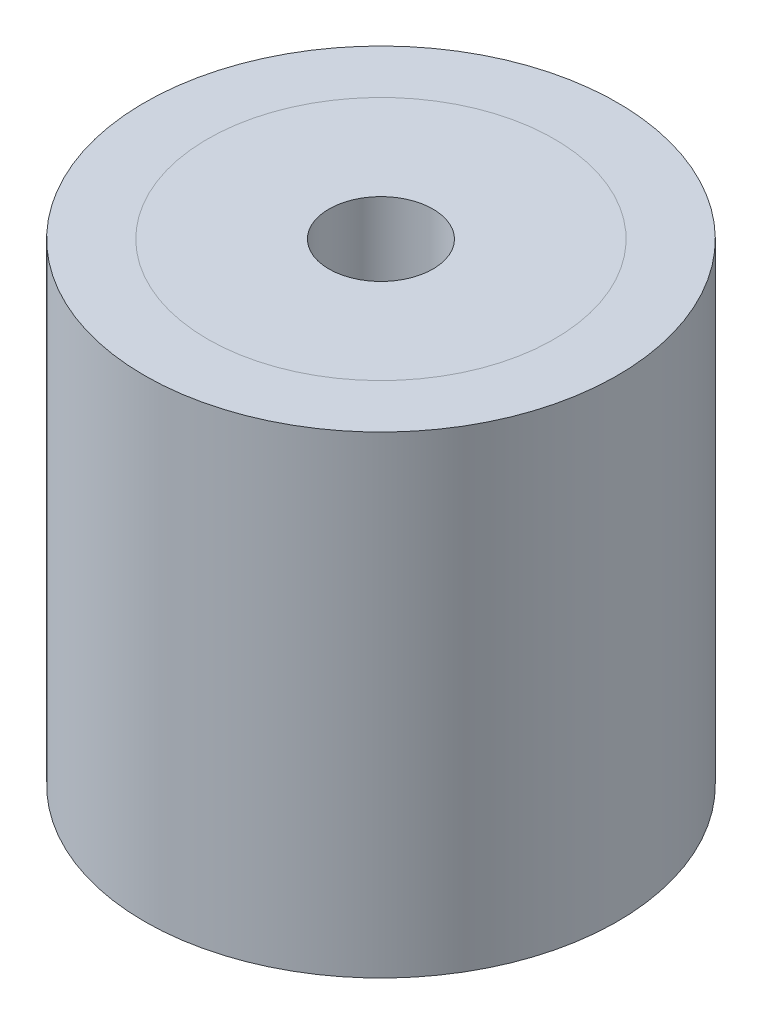
ISO-10303-21;
HEADER;
FILE_DESCRIPTION(('STEP AP214'),'2;1');
FILE_NAME('part.step','',(''),(''),'','','');
FILE_SCHEMA(('AUTOMOTIVE_DESIGN { 1 0 10303 214 1 1 1 1 }'));
ENDSEC;
DATA;
#1=APPLICATION_CONTEXT('core data for automotive mechanical design processes');
#2=APPLICATION_PROTOCOL_DEFINITION('international standard','automotive_design',2000,#1);
#3=PRODUCT_CONTEXT('',#1,'mechanical');
#4=PRODUCT('Part','Part','',(#3));
#5=PRODUCT_RELATED_PRODUCT_CATEGORY('part','',(#4));
#6=PRODUCT_DEFINITION_FORMATION('','',#4);
#7=PRODUCT_DEFINITION_CONTEXT('part definition',#1,'design');
#8=PRODUCT_DEFINITION('design','',#6,#7);
#9=PRODUCT_DEFINITION_SHAPE('','',#8);
#10=(LENGTH_UNIT() NAMED_UNIT(*) SI_UNIT(.MILLI.,.METRE.));
#11=(NAMED_UNIT(*) PLANE_ANGLE_UNIT() SI_UNIT($,.RADIAN.));
#12=(NAMED_UNIT(*) SI_UNIT($,.STERADIAN.) SOLID_ANGLE_UNIT());
#13=UNCERTAINTY_MEASURE_WITH_UNIT(LENGTH_MEASURE(1.E-05),#10,'distance_accuracy_value','');
#14=(GEOMETRIC_REPRESENTATION_CONTEXT(3) GLOBAL_UNCERTAINTY_ASSIGNED_CONTEXT((#13)) GLOBAL_UNIT_ASSIGNED_CONTEXT((#10,
#11,#12)) REPRESENTATION_CONTEXT('',''));
#15=CARTESIAN_POINT('',(0.,0.,0.));
#16=DIRECTION('',(0.,0.,1.));
#17=DIRECTION('',(1.,0.,0.));
#18=AXIS2_PLACEMENT_3D('',#15,#16,#17);
#19=CARTESIAN_POINT('',(0.,-7.5,0.));
#20=DIRECTION('',(0.,1.,0.));
#21=DIRECTION('',(0.,0.,1.));
#22=AXIS2_PLACEMENT_3D('',#19,#20,#21);
#23=PLANE('',#22);
#24=CARTESIAN_POINT('',(0.,-7.5,0.));
#25=DIRECTION('',(0.,1.,0.));
#26=DIRECTION('',(0.,0.,1.));
#27=AXIS2_PLACEMENT_3D('',#24,#25,#26);
#28=CIRCLE('',#27,7.5);
#29=CARTESIAN_POINT('',(0.,-7.5,7.5));
#30=VERTEX_POINT('',#29);
#31=EDGE_CURVE('E61',#30,#30,#28,.T.);
#32=ORIENTED_EDGE('',*,*,#31,.F.);
#33=EDGE_LOOP('',(#32));
#34=FACE_BOUND('',#33,.T.);
#35=CARTESIAN_POINT('',(0.,-7.5,0.));
#36=DIRECTION('',(0.,1.,0.));
#37=DIRECTION('',(0.,0.,1.));
#38=AXIS2_PLACEMENT_3D('',#35,#36,#37);
#39=CIRCLE('',#38,5.5);
#40=CARTESIAN_POINT('',(0.,-7.5,5.5));
#41=VERTEX_POINT('',#40);
#42=EDGE_CURVE('E10',#41,#41,#39,.F.);
#43=ORIENTED_EDGE('',*,*,#42,.F.);
#44=EDGE_LOOP('',(#43));
#45=FACE_BOUND('',#44,.T.);
#46=ADVANCED_FACE('F41',(#34,#45),#23,.F.);
#47=CARTESIAN_POINT('',(0.,7.5,0.));
#48=DIRECTION('',(0.,1.,0.));
#49=DIRECTION('',(0.,0.,1.));
#50=AXIS2_PLACEMENT_3D('',#47,#48,#49);
#51=PLANE('',#50);
#52=CARTESIAN_POINT('',(0.,7.5,0.));
#53=DIRECTION('',(0.,1.,0.));
#54=DIRECTION('',(0.,0.,1.));
#55=AXIS2_PLACEMENT_3D('',#52,#53,#54);
#56=CIRCLE('',#55,7.5);
#57=CARTESIAN_POINT('',(0.,7.5,7.5));
#58=VERTEX_POINT('',#57);
#59=EDGE_CURVE('E56',#58,#58,#56,.T.);
#60=ORIENTED_EDGE('',*,*,#59,.T.);
#61=EDGE_LOOP('',(#60));
#62=FACE_BOUND('',#61,.T.);
#63=CARTESIAN_POINT('',(0.,7.5,0.));
#64=DIRECTION('',(0.,1.,0.));
#65=DIRECTION('',(0.,0.,1.));
#66=AXIS2_PLACEMENT_3D('',#63,#64,#65);
#67=CIRCLE('',#66,5.5);
#68=CARTESIAN_POINT('',(0.,7.5,5.5));
#69=VERTEX_POINT('',#68);
#70=EDGE_CURVE('E45',#69,#69,#67,.F.);
#71=ORIENTED_EDGE('',*,*,#70,.T.);
#72=EDGE_LOOP('',(#71));
#73=FACE_BOUND('',#72,.T.);
#74=ADVANCED_FACE('F78',(#62,#73),#51,.T.);
#75=CARTESIAN_POINT('',(0.,7.5,0.));
#76=DIRECTION('',(0.,-1.,0.));
#77=DIRECTION('',(0.,0.,-1.));
#78=AXIS2_PLACEMENT_3D('',#75,#76,#77);
#79=CYLINDRICAL_SURFACE('',#78,7.5);
#80=ORIENTED_EDGE('',*,*,#59,.F.);
#81=EDGE_LOOP('',(#80));
#82=FACE_BOUND('',#81,.T.);
#83=ORIENTED_EDGE('',*,*,#31,.T.);
#84=EDGE_LOOP('',(#83));
#85=FACE_BOUND('',#84,.T.);
#86=ADVANCED_FACE('F43',(#82,#85),#79,.T.);
#87=ORIENTED_EDGE('',*,*,#70,.F.);
#88=EDGE_LOOP('',(#87));
#89=FACE_BOUND('',#88,.T.);
#90=CARTESIAN_POINT('',(0.,7.5,0.));
#91=DIRECTION('',(0.,1.,0.));
#92=DIRECTION('',(0.,0.,1.));
#93=AXIS2_PLACEMENT_3D('',#90,#91,#92);
#94=CIRCLE('',#93,1.64999999999999);
#95=CARTESIAN_POINT('',(0.,7.5,1.64999999999999));
#96=VERTEX_POINT('',#95);
#97=EDGE_CURVE('E62',#96,#96,#94,.T.);
#98=ORIENTED_EDGE('',*,*,#97,.F.);
#99=EDGE_LOOP('',(#98));
#100=FACE_BOUND('',#99,.T.);
#101=ADVANCED_FACE('F73',(#89,#100),#51,.T.);
#102=ORIENTED_EDGE('',*,*,#42,.T.);
#103=EDGE_LOOP('',(#102));
#104=FACE_BOUND('',#103,.T.);
#105=CARTESIAN_POINT('',(0.,-7.5,0.));
#106=DIRECTION('',(0.,1.,0.));
#107=DIRECTION('',(0.,0.,1.));
#108=AXIS2_PLACEMENT_3D('',#105,#106,#107);
#109=CIRCLE('',#108,1.64999999999999);
#110=CARTESIAN_POINT('',(0.,-7.5,1.64999999999999));
#111=VERTEX_POINT('',#110);
#112=EDGE_CURVE('E58',#111,#111,#109,.T.);
#113=ORIENTED_EDGE('',*,*,#112,.T.);
#114=EDGE_LOOP('',(#113));
#115=FACE_BOUND('',#114,.T.);
#116=ADVANCED_FACE('F75',(#104,#115),#23,.F.);
#117=CARTESIAN_POINT('',(0.,7.5,0.));
#118=DIRECTION('',(0.,1.,0.));
#119=DIRECTION('',(0.,0.,1.));
#120=AXIS2_PLACEMENT_3D('',#117,#118,#119);
#121=CYLINDRICAL_SURFACE('',#120,1.64999999999999);
#122=ORIENTED_EDGE('',*,*,#97,.T.);
#123=EDGE_LOOP('',(#122));
#124=FACE_BOUND('',#123,.T.);
#125=ORIENTED_EDGE('',*,*,#112,.F.);
#126=EDGE_LOOP('',(#125));
#127=FACE_BOUND('',#126,.T.);
#128=ADVANCED_FACE('F70',(#124,#127),#121,.F.);
#129=CLOSED_SHELL('',(#46,#74,#86,#101,#116,#128));
#130=MANIFOLD_SOLID_BREP('B2',#129);
#131=ADVANCED_BREP_SHAPE_REPRESENTATION('',(#18,#130),#14);
#132=SHAPE_DEFINITION_REPRESENTATION(#9,#131);
ENDSEC;
END-ISO-10303-21;
